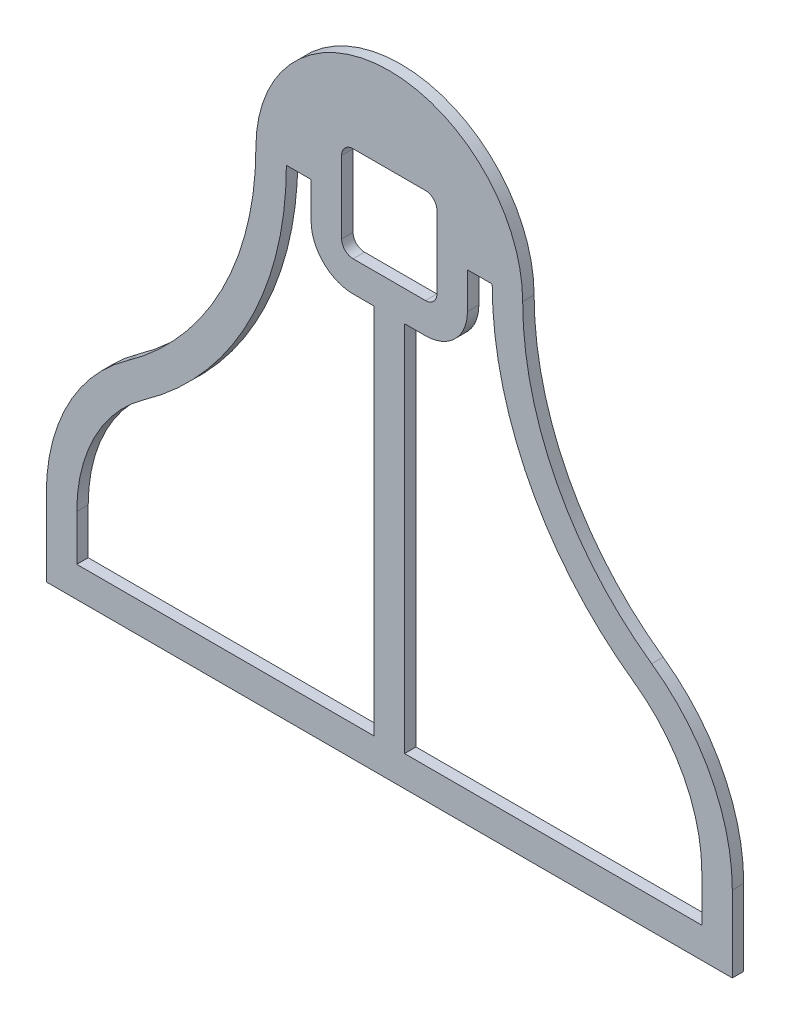
ISO-10303-21;
HEADER;
FILE_DESCRIPTION(('STEP AP214'),'2;1');
FILE_NAME('part.step','',(''),(''),'','','');
FILE_SCHEMA(('AUTOMOTIVE_DESIGN { 1 0 10303 214 1 1 1 1 }'));
ENDSEC;
DATA;
#1=APPLICATION_CONTEXT('core data for automotive mechanical design processes');
#2=APPLICATION_PROTOCOL_DEFINITION('international standard','automotive_design',2000,#1);
#3=PRODUCT_CONTEXT('',#1,'mechanical');
#4=PRODUCT('Part','Part','',(#3));
#5=PRODUCT_RELATED_PRODUCT_CATEGORY('part','',(#4));
#6=PRODUCT_DEFINITION_FORMATION('','',#4);
#7=PRODUCT_DEFINITION_CONTEXT('part definition',#1,'design');
#8=PRODUCT_DEFINITION('design','',#6,#7);
#9=PRODUCT_DEFINITION_SHAPE('','',#8);
#10=(LENGTH_UNIT() NAMED_UNIT(*) SI_UNIT(.MILLI.,.METRE.));
#11=(NAMED_UNIT(*) PLANE_ANGLE_UNIT() SI_UNIT($,.RADIAN.));
#12=(NAMED_UNIT(*) SI_UNIT($,.STERADIAN.) SOLID_ANGLE_UNIT());
#13=UNCERTAINTY_MEASURE_WITH_UNIT(LENGTH_MEASURE(1.E-05),#10,'distance_accuracy_value','');
#14=(GEOMETRIC_REPRESENTATION_CONTEXT(3) GLOBAL_UNCERTAINTY_ASSIGNED_CONTEXT((#13)) GLOBAL_UNIT_ASSIGNED_CONTEXT((#10,
#11,#12)) REPRESENTATION_CONTEXT('',''));
#15=CARTESIAN_POINT('',(0.,0.,0.));
#16=DIRECTION('',(0.,0.,1.));
#17=DIRECTION('',(1.,0.,0.));
#18=AXIS2_PLACEMENT_3D('',#15,#16,#17);
#19=CARTESIAN_POINT('',(8.,146.816197092024,0.));
#20=DIRECTION('',(0.,-1.,0.));
#21=DIRECTION('',(0.,0.,-1.));
#22=AXIS2_PLACEMENT_3D('',#19,#20,#21);
#23=PLANE('',#22);
#24=DIRECTION('',(1.,0.,0.));
#25=VECTOR('',#24,1.);
#26=CARTESIAN_POINT('',(8.,146.816197092024,0.));
#27=LINE('',#26,#25);
#28=CARTESIAN_POINT('',(94.,146.816197092024,0.));
#29=VERTEX_POINT('',#28);
#30=CARTESIAN_POINT('',(172.,146.816197092024,0.));
#31=VERTEX_POINT('',#30);
#32=EDGE_CURVE('E50',#29,#31,#27,.T.);
#33=ORIENTED_EDGE('',*,*,#32,.F.);
#34=DIRECTION('',(0.,0.,1.));
#35=VECTOR('',#34,1.);
#36=CARTESIAN_POINT('',(94.,146.816197092024,0.));
#37=LINE('',#36,#35);
#38=CARTESIAN_POINT('',(94.,146.816197092024,3.));
#39=VERTEX_POINT('',#38);
#40=EDGE_CURVE('E292',#29,#39,#37,.T.);
#41=ORIENTED_EDGE('',*,*,#40,.T.);
#42=DIRECTION('',(1.,0.,0.));
#43=VECTOR('',#42,1.);
#44=CARTESIAN_POINT('',(50.,146.816197092024,3.));
#45=LINE('',#44,#43);
#46=CARTESIAN_POINT('',(172.,146.816197092024,3.));
#47=VERTEX_POINT('',#46);
#48=EDGE_CURVE('E533',#39,#47,#45,.T.);
#49=ORIENTED_EDGE('',*,*,#48,.T.);
#50=DIRECTION('',(0.,0.,1.));
#51=VECTOR('',#50,1.);
#52=CARTESIAN_POINT('',(172.,146.816197092024,0.));
#53=LINE('',#52,#51);
#54=EDGE_CURVE('E344',#31,#47,#53,.T.);
#55=ORIENTED_EDGE('',*,*,#54,.F.);
#56=EDGE_LOOP('',(#33,#41,#49,#55));
#57=FACE_BOUND('',#56,.T.);
#58=ADVANCED_FACE('F33',(#57),#23,.F.);
#59=CARTESIAN_POINT('',(80.5,244.5,0.));
#60=DIRECTION('',(0.,1.,0.));
#61=DIRECTION('',(0.,0.,1.));
#62=AXIS2_PLACEMENT_3D('',#59,#60,#61);
#63=PLANE('',#62);
#64=DIRECTION('',(1.,0.,0.));
#65=VECTOR('',#64,1.);
#66=CARTESIAN_POINT('',(80.5,244.5,3.));
#67=LINE('',#66,#65);
#68=CARTESIAN_POINT('',(99.5,244.5,3.));
#69=VERTEX_POINT('',#68);
#70=CARTESIAN_POINT('',(94.,244.5,3.));
#71=VERTEX_POINT('',#70);
#72=EDGE_CURVE('E270',#69,#71,#67,.F.);
#73=ORIENTED_EDGE('',*,*,#72,.T.);
#74=DIRECTION('',(0.,0.,1.));
#75=VECTOR('',#74,1.);
#76=CARTESIAN_POINT('',(94.,244.5,0.));
#77=LINE('',#76,#75);
#78=CARTESIAN_POINT('',(94.,244.5,0.));
#79=VERTEX_POINT('',#78);
#80=EDGE_CURVE('E279',#79,#71,#77,.T.);
#81=ORIENTED_EDGE('',*,*,#80,.F.);
#82=DIRECTION('',(-1.,0.,0.));
#83=VECTOR('',#82,1.);
#84=CARTESIAN_POINT('',(80.5,244.5,0.));
#85=LINE('',#84,#83);
#86=CARTESIAN_POINT('',(99.5,244.5,0.));
#87=VERTEX_POINT('',#86);
#88=EDGE_CURVE('E306',#87,#79,#85,.T.);
#89=ORIENTED_EDGE('',*,*,#88,.F.);
#90=DIRECTION('',(0.,0.,1.));
#91=VECTOR('',#90,1.);
#92=CARTESIAN_POINT('',(99.5,244.5,0.));
#93=LINE('',#92,#91);
#94=EDGE_CURVE('E363',#87,#69,#93,.T.);
#95=ORIENTED_EDGE('',*,*,#94,.T.);
#96=EDGE_LOOP('',(#73,#81,#89,#95));
#97=FACE_BOUND('',#96,.T.);
#98=ADVANCED_FACE('F588',(#97),#63,.F.);
#99=CARTESIAN_POINT('',(180.,0.,15.));
#100=DIRECTION('',(-1.,0.,0.));
#101=DIRECTION('',(0.,0.,1.));
#102=AXIS2_PLACEMENT_3D('',#99,#100,#101);
#103=PLANE('',#102);
#104=DIRECTION('',(0.,1.,0.));
#105=VECTOR('',#104,1.);
#106=CARTESIAN_POINT('',(180.,138.816197092024,3.));
#107=LINE('',#106,#105);
#108=CARTESIAN_POINT('',(180.,138.816197092024,3.));
#109=VERTEX_POINT('',#108);
#110=CARTESIAN_POINT('',(180.,158.816197092024,3.));
#111=VERTEX_POINT('',#110);
#112=EDGE_CURVE('E415',#109,#111,#107,.T.);
#113=ORIENTED_EDGE('',*,*,#112,.F.);
#114=DIRECTION('',(0.,0.,1.));
#115=VECTOR('',#114,1.);
#116=CARTESIAN_POINT('',(180.,138.816197092024,0.));
#117=LINE('',#116,#115);
#118=CARTESIAN_POINT('',(180.,138.816197092024,0.));
#119=VERTEX_POINT('',#118);
#120=EDGE_CURVE('E428',#119,#109,#117,.T.);
#121=ORIENTED_EDGE('',*,*,#120,.F.);
#122=DIRECTION('',(0.,1.,0.));
#123=VECTOR('',#122,1.);
#124=CARTESIAN_POINT('',(180.,0.,0.));
#125=LINE('',#124,#123);
#126=CARTESIAN_POINT('',(180.,158.816197092024,0.));
#127=VERTEX_POINT('',#126);
#128=EDGE_CURVE('E454',#119,#127,#125,.T.);
#129=ORIENTED_EDGE('',*,*,#128,.T.);
#130=DIRECTION('',(0.,0.,-1.));
#131=VECTOR('',#130,1.);
#132=CARTESIAN_POINT('',(180.,158.816197092024,15.));
#133=LINE('',#132,#131);
#134=EDGE_CURVE('E471',#127,#111,#133,.F.);
#135=ORIENTED_EDGE('',*,*,#134,.T.);
#136=EDGE_LOOP('',(#113,#121,#129,#135));
#137=FACE_BOUND('',#136,.T.);
#138=ADVANCED_FACE('F593',(#137),#103,.F.);
#139=CARTESIAN_POINT('',(0.,0.,15.));
#140=DIRECTION('',(1.,0.,0.));
#141=DIRECTION('',(0.,0.,-1.));
#142=AXIS2_PLACEMENT_3D('',#139,#140,#141);
#143=PLANE('',#142);
#144=DIRECTION('',(0.,-1.,0.));
#145=VECTOR('',#144,1.);
#146=CARTESIAN_POINT('',(0.,158.816197092024,3.));
#147=LINE('',#146,#145);
#148=CARTESIAN_POINT('',(0.,158.816197092024,3.));
#149=VERTEX_POINT('',#148);
#150=CARTESIAN_POINT('',(0.,138.816197092024,3.));
#151=VERTEX_POINT('',#150);
#152=EDGE_CURVE('E411',#149,#151,#147,.T.);
#153=ORIENTED_EDGE('',*,*,#152,.F.);
#154=DIRECTION('',(0.,0.,-1.));
#155=VECTOR('',#154,1.);
#156=CARTESIAN_POINT('',(0.,158.816197092024,15.));
#157=LINE('',#156,#155);
#158=CARTESIAN_POINT('',(0.,158.816197092024,0.));
#159=VERTEX_POINT('',#158);
#160=EDGE_CURVE('E456',#149,#159,#157,.T.);
#161=ORIENTED_EDGE('',*,*,#160,.T.);
#162=DIRECTION('',(0.,-1.,0.));
#163=VECTOR('',#162,1.);
#164=CARTESIAN_POINT('',(0.,0.,0.));
#165=LINE('',#164,#163);
#166=CARTESIAN_POINT('',(0.,138.816197092024,0.));
#167=VERTEX_POINT('',#166);
#168=EDGE_CURVE('E444',#159,#167,#165,.T.);
#169=ORIENTED_EDGE('',*,*,#168,.T.);
#170=DIRECTION('',(0.,0.,1.));
#171=VECTOR('',#170,1.);
#172=CARTESIAN_POINT('',(0.,138.816197092024,0.));
#173=LINE('',#172,#171);
#174=EDGE_CURVE('E429',#167,#151,#173,.T.);
#175=ORIENTED_EDGE('',*,*,#174,.T.);
#176=EDGE_LOOP('',(#153,#161,#169,#175));
#177=FACE_BOUND('',#176,.T.);
#178=ADVANCED_FACE('F847',(#177),#143,.F.);
#179=CARTESIAN_POINT('',(90.,265.,15.));
#180=DIRECTION('',(0.,0.,-1.));
#181=DIRECTION('',(-1.,0.,0.));
#182=AXIS2_PLACEMENT_3D('',#179,#180,#181);
#183=CYLINDRICAL_SURFACE('',#182,35.);
#184=CARTESIAN_POINT('',(90.,265.,3.));
#185=DIRECTION('',(0.,0.,1.));
#186=DIRECTION('',(1.,0.,0.));
#187=AXIS2_PLACEMENT_3D('',#184,#185,#186);
#188=CIRCLE('',#187,35.);
#189=CARTESIAN_POINT('',(125.,265.,3.));
#190=VERTEX_POINT('',#189);
#191=CARTESIAN_POINT('',(55.,265.,3.));
#192=VERTEX_POINT('',#191);
#193=EDGE_CURVE('E421',#190,#192,#188,.T.);
#194=ORIENTED_EDGE('',*,*,#193,.F.);
#195=DIRECTION('',(0.,0.,-1.));
#196=VECTOR('',#195,1.);
#197=CARTESIAN_POINT('',(125.,265.,15.));
#198=LINE('',#197,#196);
#199=CARTESIAN_POINT('',(125.,265.,0.));
#200=VERTEX_POINT('',#199);
#201=EDGE_CURVE('E432',#190,#200,#198,.T.);
#202=ORIENTED_EDGE('',*,*,#201,.T.);
#203=CARTESIAN_POINT('',(90.,265.,0.));
#204=DIRECTION('',(0.,0.,-1.));
#205=DIRECTION('',(-1.,0.,0.));
#206=AXIS2_PLACEMENT_3D('',#203,#204,#205);
#207=CIRCLE('',#206,35.);
#208=CARTESIAN_POINT('',(55.,265.,0.));
#209=VERTEX_POINT('',#208);
#210=EDGE_CURVE('E437',#200,#209,#207,.F.);
#211=ORIENTED_EDGE('',*,*,#210,.T.);
#212=DIRECTION('',(0.,0.,-1.));
#213=VECTOR('',#212,1.);
#214=CARTESIAN_POINT('',(55.,265.,15.));
#215=LINE('',#214,#213);
#216=EDGE_CURVE('E435',#192,#209,#215,.T.);
#217=ORIENTED_EDGE('',*,*,#216,.F.);
#218=EDGE_LOOP('',(#194,#202,#211,#217));
#219=FACE_BOUND('',#218,.T.);
#220=ADVANCED_FACE('F837',(#219),#183,.T.);
#221=CARTESIAN_POINT('',(-25.,265.,15.));
#222=DIRECTION('',(0.,0.,-1.));
#223=DIRECTION('',(-1.,0.,0.));
#224=AXIS2_PLACEMENT_3D('',#221,#222,#223);
#225=CYLINDRICAL_SURFACE('',#224,80.);
#226=CARTESIAN_POINT('',(-25.,265.,3.));
#227=DIRECTION('',(0.,0.,-1.));
#228=DIRECTION('',(1.,0.,0.));
#229=AXIS2_PLACEMENT_3D('',#226,#227,#228);
#230=CIRCLE('',#229,80.);
#231=CARTESIAN_POINT('',(21.1538461538462,199.656121287399,3.));
#232=VERTEX_POINT('',#231);
#233=EDGE_CURVE('E423',#192,#232,#230,.T.);
#234=ORIENTED_EDGE('',*,*,#233,.F.);
#235=ORIENTED_EDGE('',*,*,#216,.T.);
#236=CARTESIAN_POINT('',(-25.,265.,0.));
#237=DIRECTION('',(0.,0.,-1.));
#238=DIRECTION('',(-1.,0.,0.));
#239=AXIS2_PLACEMENT_3D('',#236,#237,#238);
#240=CIRCLE('',#239,80.);
#241=CARTESIAN_POINT('',(21.1538461538461,199.656121287399,0.));
#242=VERTEX_POINT('',#241);
#243=EDGE_CURVE('E441',#209,#242,#240,.T.);
#244=ORIENTED_EDGE('',*,*,#243,.T.);
#245=DIRECTION('',(0.,0.,-1.));
#246=VECTOR('',#245,1.);
#247=CARTESIAN_POINT('',(21.1538461538461,199.656121287399,15.));
#248=LINE('',#247,#246);
#249=EDGE_CURVE('E466',#242,#232,#248,.F.);
#250=ORIENTED_EDGE('',*,*,#249,.T.);
#251=EDGE_LOOP('',(#234,#235,#244,#250));
#252=FACE_BOUND('',#251,.T.);
#253=ADVANCED_FACE('F827',(#252),#225,.F.);
#254=CARTESIAN_POINT('',(205.,265.,15.));
#255=DIRECTION('',(0.,0.,-1.));
#256=DIRECTION('',(-1.,0.,0.));
#257=AXIS2_PLACEMENT_3D('',#254,#255,#256);
#258=CYLINDRICAL_SURFACE('',#257,80.);
#259=CARTESIAN_POINT('',(205.,265.,3.));
#260=DIRECTION('',(0.,0.,-1.));
#261=DIRECTION('',(1.,0.,0.));
#262=AXIS2_PLACEMENT_3D('',#259,#260,#261);
#263=CIRCLE('',#262,80.);
#264=CARTESIAN_POINT('',(158.846153846154,199.656121287399,3.));
#265=VERTEX_POINT('',#264);
#266=EDGE_CURVE('E419',#265,#190,#263,.T.);
#267=ORIENTED_EDGE('',*,*,#266,.F.);
#268=DIRECTION('',(0.,0.,-1.));
#269=VECTOR('',#268,1.);
#270=CARTESIAN_POINT('',(158.846153846154,199.656121287399,15.));
#271=LINE('',#270,#269);
#272=CARTESIAN_POINT('',(158.846153846154,199.656121287399,0.));
#273=VERTEX_POINT('',#272);
#274=EDGE_CURVE('E469',#265,#273,#271,.T.);
#275=ORIENTED_EDGE('',*,*,#274,.T.);
#276=CARTESIAN_POINT('',(205.,265.,0.));
#277=DIRECTION('',(0.,0.,-1.));
#278=DIRECTION('',(-1.,0.,0.));
#279=AXIS2_PLACEMENT_3D('',#276,#277,#278);
#280=CIRCLE('',#279,80.);
#281=EDGE_CURVE('E459',#273,#200,#280,.T.);
#282=ORIENTED_EDGE('',*,*,#281,.T.);
#283=ORIENTED_EDGE('',*,*,#201,.F.);
#284=EDGE_LOOP('',(#267,#275,#282,#283));
#285=FACE_BOUND('',#284,.T.);
#286=ADVANCED_FACE('F817',(#285),#258,.F.);
#287=CARTESIAN_POINT('',(50.,158.816197092024,15.));
#288=DIRECTION('',(0.,0.,-1.));
#289=DIRECTION('',(-1.,0.,0.));
#290=AXIS2_PLACEMENT_3D('',#287,#288,#289);
#291=CYLINDRICAL_SURFACE('',#290,50.);
#292=ORIENTED_EDGE('',*,*,#160,.F.);
#293=CARTESIAN_POINT('',(50.,158.816197092024,3.));
#294=DIRECTION('',(0.,0.,1.));
#295=DIRECTION('',(1.,0.,0.));
#296=AXIS2_PLACEMENT_3D('',#293,#294,#295);
#297=CIRCLE('',#296,50.);
#298=EDGE_CURVE('E409',#232,#149,#297,.T.);
#299=ORIENTED_EDGE('',*,*,#298,.F.);
#300=ORIENTED_EDGE('',*,*,#249,.F.);
#301=CARTESIAN_POINT('',(50.,158.816197092024,0.));
#302=DIRECTION('',(0.,0.,-1.));
#303=DIRECTION('',(-1.,0.,0.));
#304=AXIS2_PLACEMENT_3D('',#301,#302,#303);
#305=CIRCLE('',#304,50.);
#306=EDGE_CURVE('E464',#159,#242,#305,.T.);
#307=ORIENTED_EDGE('',*,*,#306,.F.);
#308=EDGE_LOOP('',(#292,#299,#300,#307));
#309=FACE_BOUND('',#308,.T.);
#310=ADVANCED_FACE('F807',(#309),#291,.T.);
#311=CARTESIAN_POINT('',(130.,158.816197092024,15.));
#312=DIRECTION('',(0.,0.,-1.));
#313=DIRECTION('',(-1.,0.,0.));
#314=AXIS2_PLACEMENT_3D('',#311,#312,#313);
#315=CYLINDRICAL_SURFACE('',#314,50.);
#316=ORIENTED_EDGE('',*,*,#274,.F.);
#317=CARTESIAN_POINT('',(130.,158.816197092024,3.));
#318=DIRECTION('',(0.,0.,1.));
#319=DIRECTION('',(1.,0.,0.));
#320=AXIS2_PLACEMENT_3D('',#317,#318,#319);
#321=CIRCLE('',#320,50.);
#322=EDGE_CURVE('E417',#111,#265,#321,.T.);
#323=ORIENTED_EDGE('',*,*,#322,.F.);
#324=ORIENTED_EDGE('',*,*,#134,.F.);
#325=CARTESIAN_POINT('',(130.,158.816197092024,0.));
#326=DIRECTION('',(0.,0.,-1.));
#327=DIRECTION('',(-1.,0.,0.));
#328=AXIS2_PLACEMENT_3D('',#325,#326,#327);
#329=CIRCLE('',#328,50.);
#330=EDGE_CURVE('E458',#273,#127,#329,.T.);
#331=ORIENTED_EDGE('',*,*,#330,.F.);
#332=EDGE_LOOP('',(#316,#323,#324,#331));
#333=FACE_BOUND('',#332,.T.);
#334=ADVANCED_FACE('F797',(#333),#315,.T.);
#335=CARTESIAN_POINT('',(77.5,277.5,15.));
#336=DIRECTION('',(-1.,0.,0.));
#337=DIRECTION('',(0.,0.,1.));
#338=AXIS2_PLACEMENT_3D('',#335,#336,#337);
#339=PLANE('',#338);
#340=DIRECTION('',(0.,-1.,0.));
#341=VECTOR('',#340,1.);
#342=CARTESIAN_POINT('',(77.5,255.5,3.));
#343=LINE('',#342,#341);
#344=CARTESIAN_POINT('',(77.5,274.5,3.));
#345=VERTEX_POINT('',#344);
#346=CARTESIAN_POINT('',(77.5,255.5,3.));
#347=VERTEX_POINT('',#346);
#348=EDGE_CURVE('E400',#345,#347,#343,.T.);
#349=ORIENTED_EDGE('',*,*,#348,.T.);
#350=DIRECTION('',(0.,0.,-1.));
#351=VECTOR('',#350,1.);
#352=CARTESIAN_POINT('',(77.5,255.5,0.));
#353=LINE('',#352,#351);
#354=CARTESIAN_POINT('',(77.5,255.5,0.));
#355=VERTEX_POINT('',#354);
#356=EDGE_CURVE('E491',#347,#355,#353,.T.);
#357=ORIENTED_EDGE('',*,*,#356,.T.);
#358=DIRECTION('',(0.,1.,0.));
#359=VECTOR('',#358,1.);
#360=CARTESIAN_POINT('',(77.5,0.,0.));
#361=LINE('',#360,#359);
#362=CARTESIAN_POINT('',(77.5,274.5,0.));
#363=VERTEX_POINT('',#362);
#364=EDGE_CURVE('E483',#355,#363,#361,.T.);
#365=ORIENTED_EDGE('',*,*,#364,.T.);
#366=DIRECTION('',(0.,0.,-1.));
#367=VECTOR('',#366,1.);
#368=CARTESIAN_POINT('',(77.5,274.5,15.));
#369=LINE('',#368,#367);
#370=EDGE_CURVE('E493',#363,#345,#369,.F.);
#371=ORIENTED_EDGE('',*,*,#370,.T.);
#372=EDGE_LOOP('',(#349,#357,#365,#371));
#373=FACE_BOUND('',#372,.T.);
#374=ADVANCED_FACE('F787',(#373),#339,.F.);
#375=CARTESIAN_POINT('',(102.5,252.5,15.));
#376=DIRECTION('',(0.,-1.,0.));
#377=DIRECTION('',(0.,0.,-1.));
#378=AXIS2_PLACEMENT_3D('',#375,#376,#377);
#379=PLANE('',#378);
#380=DIRECTION('',(1.,0.,0.));
#381=VECTOR('',#380,1.);
#382=CARTESIAN_POINT('',(99.5,252.5,3.));
#383=LINE('',#382,#381);
#384=CARTESIAN_POINT('',(80.5,252.5,3.));
#385=VERTEX_POINT('',#384);
#386=CARTESIAN_POINT('',(99.5,252.5,3.));
#387=VERTEX_POINT('',#386);
#388=EDGE_CURVE('E406',#385,#387,#383,.T.);
#389=ORIENTED_EDGE('',*,*,#388,.T.);
#390=DIRECTION('',(0.,0.,-1.));
#391=VECTOR('',#390,1.);
#392=CARTESIAN_POINT('',(99.5,252.5,0.));
#393=LINE('',#392,#391);
#394=CARTESIAN_POINT('',(99.5,252.5,0.));
#395=VERTEX_POINT('',#394);
#396=EDGE_CURVE('E501',#387,#395,#393,.T.);
#397=ORIENTED_EDGE('',*,*,#396,.T.);
#398=DIRECTION('',(-1.,0.,0.));
#399=VECTOR('',#398,1.);
#400=CARTESIAN_POINT('',(0.,252.5,0.));
#401=LINE('',#400,#399);
#402=CARTESIAN_POINT('',(80.5,252.5,0.));
#403=VERTEX_POINT('',#402);
#404=EDGE_CURVE('E480',#395,#403,#401,.T.);
#405=ORIENTED_EDGE('',*,*,#404,.T.);
#406=DIRECTION('',(0.,0.,-1.));
#407=VECTOR('',#406,1.);
#408=CARTESIAN_POINT('',(80.5,252.5,15.));
#409=LINE('',#408,#407);
#410=EDGE_CURVE('E503',#403,#385,#409,.F.);
#411=ORIENTED_EDGE('',*,*,#410,.T.);
#412=EDGE_LOOP('',(#389,#397,#405,#411));
#413=FACE_BOUND('',#412,.T.);
#414=ADVANCED_FACE('F777',(#413),#379,.F.);
#415=CARTESIAN_POINT('',(102.5,277.5,15.));
#416=DIRECTION('',(1.,0.,0.));
#417=DIRECTION('',(0.,0.,-1.));
#418=AXIS2_PLACEMENT_3D('',#415,#416,#417);
#419=PLANE('',#418);
#420=DIRECTION('',(0.,1.,0.));
#421=VECTOR('',#420,1.);
#422=CARTESIAN_POINT('',(102.5,274.5,3.));
#423=LINE('',#422,#421);
#424=CARTESIAN_POINT('',(102.5,255.5,3.));
#425=VERTEX_POINT('',#424);
#426=CARTESIAN_POINT('',(102.5,274.5,3.));
#427=VERTEX_POINT('',#426);
#428=EDGE_CURVE('E388',#425,#427,#423,.T.);
#429=ORIENTED_EDGE('',*,*,#428,.T.);
#430=DIRECTION('',(0.,0.,-1.));
#431=VECTOR('',#430,1.);
#432=CARTESIAN_POINT('',(102.5,274.5,0.));
#433=LINE('',#432,#431);
#434=CARTESIAN_POINT('',(102.5,274.5,0.));
#435=VERTEX_POINT('',#434);
#436=EDGE_CURVE('E499',#427,#435,#433,.T.);
#437=ORIENTED_EDGE('',*,*,#436,.T.);
#438=DIRECTION('',(0.,-1.,0.));
#439=VECTOR('',#438,1.);
#440=CARTESIAN_POINT('',(102.5,0.,0.));
#441=LINE('',#440,#439);
#442=CARTESIAN_POINT('',(102.5,255.5,0.));
#443=VERTEX_POINT('',#442);
#444=EDGE_CURVE('E477',#435,#443,#441,.T.);
#445=ORIENTED_EDGE('',*,*,#444,.T.);
#446=DIRECTION('',(0.,0.,-1.));
#447=VECTOR('',#446,1.);
#448=CARTESIAN_POINT('',(102.5,255.5,15.));
#449=LINE('',#448,#447);
#450=EDGE_CURVE('E496',#443,#425,#449,.F.);
#451=ORIENTED_EDGE('',*,*,#450,.T.);
#452=EDGE_LOOP('',(#429,#437,#445,#451));
#453=FACE_BOUND('',#452,.T.);
#454=ADVANCED_FACE('F767',(#453),#419,.F.);
#455=CARTESIAN_POINT('',(102.5,277.5,15.));
#456=DIRECTION('',(0.,1.,0.));
#457=DIRECTION('',(0.,0.,1.));
#458=AXIS2_PLACEMENT_3D('',#455,#456,#457);
#459=PLANE('',#458);
#460=DIRECTION('',(-1.,0.,0.));
#461=VECTOR('',#460,1.);
#462=CARTESIAN_POINT('',(80.5,277.5,3.));
#463=LINE('',#462,#461);
#464=CARTESIAN_POINT('',(99.5,277.5,3.));
#465=VERTEX_POINT('',#464);
#466=CARTESIAN_POINT('',(80.5,277.5,3.));
#467=VERTEX_POINT('',#466);
#468=EDGE_CURVE('E394',#465,#467,#463,.T.);
#469=ORIENTED_EDGE('',*,*,#468,.T.);
#470=DIRECTION('',(0.,0.,-1.));
#471=VECTOR('',#470,1.);
#472=CARTESIAN_POINT('',(80.5,277.5,0.));
#473=LINE('',#472,#471);
#474=CARTESIAN_POINT('',(80.5,277.5,0.));
#475=VERTEX_POINT('',#474);
#476=EDGE_CURVE('E489',#467,#475,#473,.T.);
#477=ORIENTED_EDGE('',*,*,#476,.T.);
#478=DIRECTION('',(1.,0.,0.));
#479=VECTOR('',#478,1.);
#480=CARTESIAN_POINT('',(0.,277.5,0.));
#481=LINE('',#480,#479);
#482=CARTESIAN_POINT('',(99.5,277.5,0.));
#483=VERTEX_POINT('',#482);
#484=EDGE_CURVE('E474',#475,#483,#481,.T.);
#485=ORIENTED_EDGE('',*,*,#484,.T.);
#486=DIRECTION('',(0.,0.,-1.));
#487=VECTOR('',#486,1.);
#488=CARTESIAN_POINT('',(99.5,277.5,15.));
#489=LINE('',#488,#487);
#490=EDGE_CURVE('E486',#483,#465,#489,.F.);
#491=ORIENTED_EDGE('',*,*,#490,.T.);
#492=EDGE_LOOP('',(#469,#477,#485,#491));
#493=FACE_BOUND('',#492,.T.);
#494=ADVANCED_FACE('F757',(#493),#459,.F.);
#495=CARTESIAN_POINT('',(80.5,274.5,15.));
#496=DIRECTION('',(0.,0.,1.));
#497=DIRECTION('',(1.,0.,0.));
#498=AXIS2_PLACEMENT_3D('',#495,#496,#497);
#499=CYLINDRICAL_SURFACE('',#498,3.);
#500=CARTESIAN_POINT('',(80.5,274.5,3.));
#501=DIRECTION('',(0.,0.,1.));
#502=DIRECTION('',(1.,0.,0.));
#503=AXIS2_PLACEMENT_3D('',#500,#501,#502);
#504=CIRCLE('',#503,3.);
#505=EDGE_CURVE('E397',#467,#345,#504,.T.);
#506=ORIENTED_EDGE('',*,*,#505,.T.);
#507=ORIENTED_EDGE('',*,*,#370,.F.);
#508=CARTESIAN_POINT('',(80.5,274.5,0.));
#509=DIRECTION('',(0.,0.,-1.));
#510=DIRECTION('',(-1.,0.,0.));
#511=AXIS2_PLACEMENT_3D('',#508,#509,#510);
#512=CIRCLE('',#511,3.);
#513=EDGE_CURVE('E506',#475,#363,#512,.F.);
#514=ORIENTED_EDGE('',*,*,#513,.F.);
#515=ORIENTED_EDGE('',*,*,#476,.F.);
#516=EDGE_LOOP('',(#506,#507,#514,#515));
#517=FACE_BOUND('',#516,.T.);
#518=ADVANCED_FACE('F747',(#517),#499,.F.);
#519=CARTESIAN_POINT('',(99.5,274.5,15.));
#520=DIRECTION('',(0.,0.,1.));
#521=DIRECTION('',(1.,0.,0.));
#522=AXIS2_PLACEMENT_3D('',#519,#520,#521);
#523=CYLINDRICAL_SURFACE('',#522,3.);
#524=CARTESIAN_POINT('',(99.5,274.5,3.));
#525=DIRECTION('',(0.,0.,1.));
#526=DIRECTION('',(1.,0.,0.));
#527=AXIS2_PLACEMENT_3D('',#524,#525,#526);
#528=CIRCLE('',#527,3.);
#529=EDGE_CURVE('E391',#427,#465,#528,.T.);
#530=ORIENTED_EDGE('',*,*,#529,.T.);
#531=ORIENTED_EDGE('',*,*,#490,.F.);
#532=CARTESIAN_POINT('',(99.5,274.5,0.));
#533=DIRECTION('',(0.,0.,-1.));
#534=DIRECTION('',(-1.,0.,0.));
#535=AXIS2_PLACEMENT_3D('',#532,#533,#534);
#536=CIRCLE('',#535,3.);
#537=EDGE_CURVE('E508',#435,#483,#536,.F.);
#538=ORIENTED_EDGE('',*,*,#537,.F.);
#539=ORIENTED_EDGE('',*,*,#436,.F.);
#540=EDGE_LOOP('',(#530,#531,#538,#539));
#541=FACE_BOUND('',#540,.T.);
#542=ADVANCED_FACE('F738',(#541),#523,.F.);
#543=CARTESIAN_POINT('',(80.5,255.5,15.));
#544=DIRECTION('',(0.,0.,1.));
#545=DIRECTION('',(1.,0.,0.));
#546=AXIS2_PLACEMENT_3D('',#543,#544,#545);
#547=CYLINDRICAL_SURFACE('',#546,3.);
#548=CARTESIAN_POINT('',(80.5,255.5,3.));
#549=DIRECTION('',(0.,0.,1.));
#550=DIRECTION('',(1.,0.,0.));
#551=AXIS2_PLACEMENT_3D('',#548,#549,#550);
#552=CIRCLE('',#551,3.);
#553=EDGE_CURVE('E403',#347,#385,#552,.T.);
#554=ORIENTED_EDGE('',*,*,#553,.T.);
#555=ORIENTED_EDGE('',*,*,#410,.F.);
#556=CARTESIAN_POINT('',(80.5,255.5,0.));
#557=DIRECTION('',(0.,0.,-1.));
#558=DIRECTION('',(-1.,0.,0.));
#559=AXIS2_PLACEMENT_3D('',#556,#557,#558);
#560=CIRCLE('',#559,3.);
#561=EDGE_CURVE('E510',#355,#403,#560,.F.);
#562=ORIENTED_EDGE('',*,*,#561,.F.);
#563=ORIENTED_EDGE('',*,*,#356,.F.);
#564=EDGE_LOOP('',(#554,#555,#562,#563));
#565=FACE_BOUND('',#564,.T.);
#566=ADVANCED_FACE('F729',(#565),#547,.F.);
#567=CARTESIAN_POINT('',(99.5,255.5,15.));
#568=DIRECTION('',(0.,0.,1.));
#569=DIRECTION('',(1.,0.,0.));
#570=AXIS2_PLACEMENT_3D('',#567,#568,#569);
#571=CYLINDRICAL_SURFACE('',#570,3.);
#572=CARTESIAN_POINT('',(99.5,255.5,3.));
#573=DIRECTION('',(0.,0.,1.));
#574=DIRECTION('',(1.,0.,0.));
#575=AXIS2_PLACEMENT_3D('',#572,#573,#574);
#576=CIRCLE('',#575,3.);
#577=EDGE_CURVE('E371',#387,#425,#576,.T.);
#578=ORIENTED_EDGE('',*,*,#577,.T.);
#579=ORIENTED_EDGE('',*,*,#450,.F.);
#580=CARTESIAN_POINT('',(99.5,255.5,0.));
#581=DIRECTION('',(0.,0.,-1.));
#582=DIRECTION('',(-1.,0.,0.));
#583=AXIS2_PLACEMENT_3D('',#580,#581,#582);
#584=CIRCLE('',#583,3.);
#585=EDGE_CURVE('E512',#395,#443,#584,.F.);
#586=ORIENTED_EDGE('',*,*,#585,.F.);
#587=ORIENTED_EDGE('',*,*,#396,.F.);
#588=EDGE_LOOP('',(#578,#579,#586,#587));
#589=FACE_BOUND('',#588,.T.);
#590=ADVANCED_FACE('F35',(#589),#571,.F.);
#591=CARTESIAN_POINT('',(0.,138.816197092024,0.));
#592=DIRECTION('',(0.,1.,0.));
#593=DIRECTION('',(0.,0.,1.));
#594=AXIS2_PLACEMENT_3D('',#591,#592,#593);
#595=PLANE('',#594);
#596=DIRECTION('',(1.,0.,0.));
#597=VECTOR('',#596,1.);
#598=CARTESIAN_POINT('',(0.,138.816197092024,3.));
#599=LINE('',#598,#597);
#600=EDGE_CURVE('E413',#151,#109,#599,.T.);
#601=ORIENTED_EDGE('',*,*,#600,.F.);
#602=ORIENTED_EDGE('',*,*,#174,.F.);
#603=DIRECTION('',(-1.,0.,0.));
#604=VECTOR('',#603,1.);
#605=CARTESIAN_POINT('',(0.,138.816197092024,0.));
#606=LINE('',#605,#604);
#607=EDGE_CURVE('E425',#119,#167,#606,.T.);
#608=ORIENTED_EDGE('',*,*,#607,.F.);
#609=ORIENTED_EDGE('',*,*,#120,.T.);
#610=EDGE_LOOP('',(#601,#602,#608,#609));
#611=FACE_BOUND('',#610,.T.);
#612=ADVANCED_FACE('F713',(#611),#595,.F.);
#613=CARTESIAN_POINT('',(0.,0.,0.));
#614=DIRECTION('',(0.,0.,-1.));
#615=DIRECTION('',(-1.,0.,0.));
#616=AXIS2_PLACEMENT_3D('',#613,#614,#615);
#617=PLANE('',#616);
#618=DIRECTION('',(0.,1.,0.));
#619=VECTOR('',#618,1.);
#620=CARTESIAN_POINT('',(94.,146.816197092024,0.));
#621=LINE('',#620,#619);
#622=EDGE_CURVE('E282',#29,#79,#621,.T.);
#623=ORIENTED_EDGE('',*,*,#622,.F.);
#624=ORIENTED_EDGE('',*,*,#32,.T.);
#625=DIRECTION('',(0.,1.,0.));
#626=VECTOR('',#625,1.);
#627=CARTESIAN_POINT('',(172.,146.816197092024,0.));
#628=LINE('',#627,#626);
#629=CARTESIAN_POINT('',(172.,158.816197092024,0.));
#630=VERTEX_POINT('',#629);
#631=EDGE_CURVE('E329',#31,#630,#628,.T.);
#632=ORIENTED_EDGE('',*,*,#631,.T.);
#633=CARTESIAN_POINT('',(130.,158.816197092024,0.));
#634=DIRECTION('',(0.,0.,1.));
#635=DIRECTION('',(1.,0.,0.));
#636=AXIS2_PLACEMENT_3D('',#633,#634,#635);
#637=CIRCLE('',#636,42.);
#638=CARTESIAN_POINT('',(154.230769230769,193.121733416139,0.));
#639=VERTEX_POINT('',#638);
#640=EDGE_CURVE('E332',#630,#639,#637,.T.);
#641=ORIENTED_EDGE('',*,*,#640,.T.);
#642=CARTESIAN_POINT('',(205.,265.,0.));
#643=DIRECTION('',(0.,0.,-1.));
#644=DIRECTION('',(1.,0.,0.));
#645=AXIS2_PLACEMENT_3D('',#642,#643,#644);
#646=CIRCLE('',#645,88.);
#647=CARTESIAN_POINT('',(117.,265.,0.));
#648=VERTEX_POINT('',#647);
#649=EDGE_CURVE('E335',#639,#648,#646,.T.);
#650=ORIENTED_EDGE('',*,*,#649,.T.);
#651=DIRECTION('',(-1.,0.,0.));
#652=VECTOR('',#651,1.);
#653=CARTESIAN_POINT('',(110.5,265.,0.));
#654=LINE('',#653,#652);
#655=CARTESIAN_POINT('',(110.5,265.,0.));
#656=VERTEX_POINT('',#655);
#657=EDGE_CURVE('E294',#648,#656,#654,.T.);
#658=ORIENTED_EDGE('',*,*,#657,.T.);
#659=DIRECTION('',(0.,-1.,0.));
#660=VECTOR('',#659,1.);
#661=CARTESIAN_POINT('',(110.5,255.5,0.));
#662=LINE('',#661,#660);
#663=CARTESIAN_POINT('',(110.5,255.5,0.));
#664=VERTEX_POINT('',#663);
#665=EDGE_CURVE('E300',#656,#664,#662,.T.);
#666=ORIENTED_EDGE('',*,*,#665,.T.);
#667=CARTESIAN_POINT('',(99.5,255.5,0.));
#668=DIRECTION('',(0.,0.,-1.));
#669=DIRECTION('',(1.,0.,0.));
#670=AXIS2_PLACEMENT_3D('',#667,#668,#669);
#671=CIRCLE('',#670,11.);
#672=EDGE_CURVE('E303',#664,#87,#671,.T.);
#673=ORIENTED_EDGE('',*,*,#672,.T.);
#674=ORIENTED_EDGE('',*,*,#88,.T.);
#675=EDGE_LOOP('',(#623,#624,#632,#641,#650,#658,#666,#673,#674));
#676=FACE_BOUND('',#675,.T.);
#677=CARTESIAN_POINT('',(8.,146.816197092024,0.));
#678=VERTEX_POINT('',#677);
#679=CARTESIAN_POINT('',(86.,146.816197092024,0.));
#680=VERTEX_POINT('',#679);
#681=EDGE_CURVE('E327',#678,#680,#27,.T.);
#682=ORIENTED_EDGE('',*,*,#681,.T.);
#683=DIRECTION('',(0.,-1.,0.));
#684=VECTOR('',#683,1.);
#685=CARTESIAN_POINT('',(86.,146.816197092024,0.));
#686=LINE('',#685,#684);
#687=CARTESIAN_POINT('',(86.,244.5,0.));
#688=VERTEX_POINT('',#687);
#689=EDGE_CURVE('E286',#688,#680,#686,.T.);
#690=ORIENTED_EDGE('',*,*,#689,.F.);
#691=CARTESIAN_POINT('',(80.5,244.5,0.));
#692=VERTEX_POINT('',#691);
#693=EDGE_CURVE('E275',#688,#692,#85,.T.);
#694=ORIENTED_EDGE('',*,*,#693,.T.);
#695=CARTESIAN_POINT('',(80.5,255.5,0.));
#696=DIRECTION('',(0.,0.,-1.));
#697=DIRECTION('',(1.,0.,0.));
#698=AXIS2_PLACEMENT_3D('',#695,#696,#697);
#699=CIRCLE('',#698,11.);
#700=CARTESIAN_POINT('',(69.5,255.5,0.));
#701=VERTEX_POINT('',#700);
#702=EDGE_CURVE('E309',#692,#701,#699,.T.);
#703=ORIENTED_EDGE('',*,*,#702,.T.);
#704=DIRECTION('',(0.,1.,0.));
#705=VECTOR('',#704,1.);
#706=CARTESIAN_POINT('',(69.5,255.5,0.));
#707=LINE('',#706,#705);
#708=CARTESIAN_POINT('',(69.5,265.,0.));
#709=VERTEX_POINT('',#708);
#710=EDGE_CURVE('E312',#701,#709,#707,.T.);
#711=ORIENTED_EDGE('',*,*,#710,.T.);
#712=DIRECTION('',(-1.,0.,0.));
#713=VECTOR('',#712,1.);
#714=CARTESIAN_POINT('',(69.5,265.,0.));
#715=LINE('',#714,#713);
#716=CARTESIAN_POINT('',(63.,265.,0.));
#717=VERTEX_POINT('',#716);
#718=EDGE_CURVE('E315',#709,#717,#715,.T.);
#719=ORIENTED_EDGE('',*,*,#718,.T.);
#720=CARTESIAN_POINT('',(-25.,265.,0.));
#721=DIRECTION('',(0.,0.,-1.));
#722=DIRECTION('',(1.,0.,0.));
#723=AXIS2_PLACEMENT_3D('',#720,#721,#722);
#724=CIRCLE('',#723,88.);
#725=CARTESIAN_POINT('',(25.7692307692308,193.121733416139,0.));
#726=VERTEX_POINT('',#725);
#727=EDGE_CURVE('E318',#717,#726,#724,.T.);
#728=ORIENTED_EDGE('',*,*,#727,.T.);
#729=CARTESIAN_POINT('',(50.,158.816197092024,0.));
#730=DIRECTION('',(0.,0.,1.));
#731=DIRECTION('',(1.,0.,0.));
#732=AXIS2_PLACEMENT_3D('',#729,#730,#731);
#733=CIRCLE('',#732,42.);
#734=CARTESIAN_POINT('',(7.99999999999998,158.816197092024,0.));
#735=VERTEX_POINT('',#734);
#736=EDGE_CURVE('E321',#726,#735,#733,.T.);
#737=ORIENTED_EDGE('',*,*,#736,.T.);
#738=DIRECTION('',(0.,-1.,0.));
#739=VECTOR('',#738,1.);
#740=CARTESIAN_POINT('',(7.99999999999999,158.816197092024,0.));
#741=LINE('',#740,#739);
#742=EDGE_CURVE('E324',#735,#678,#741,.T.);
#743=ORIENTED_EDGE('',*,*,#742,.T.);
#744=EDGE_LOOP('',(#682,#690,#694,#703,#711,#719,#728,#737,#743));
#745=FACE_BOUND('',#744,.T.);
#746=ORIENTED_EDGE('',*,*,#607,.T.);
#747=ORIENTED_EDGE('',*,*,#168,.F.);
#748=ORIENTED_EDGE('',*,*,#306,.T.);
#749=ORIENTED_EDGE('',*,*,#243,.F.);
#750=ORIENTED_EDGE('',*,*,#210,.F.);
#751=ORIENTED_EDGE('',*,*,#281,.F.);
#752=ORIENTED_EDGE('',*,*,#330,.T.);
#753=ORIENTED_EDGE('',*,*,#128,.F.);
#754=EDGE_LOOP('',(#746,#747,#748,#749,#750,#751,#752,#753));
#755=FACE_BOUND('',#754,.T.);
#756=ORIENTED_EDGE('',*,*,#364,.F.);
#757=ORIENTED_EDGE('',*,*,#561,.T.);
#758=ORIENTED_EDGE('',*,*,#404,.F.);
#759=ORIENTED_EDGE('',*,*,#585,.T.);
#760=ORIENTED_EDGE('',*,*,#444,.F.);
#761=ORIENTED_EDGE('',*,*,#537,.T.);
#762=ORIENTED_EDGE('',*,*,#484,.F.);
#763=ORIENTED_EDGE('',*,*,#513,.T.);
#764=EDGE_LOOP('',(#756,#757,#758,#759,#760,#761,#762,#763));
#765=FACE_BOUND('',#764,.T.);
#766=ADVANCED_FACE('F566',(#676,#745,#755,#765),#617,.T.);
#767=CARTESIAN_POINT('',(50.,158.816197092024,3.));
#768=DIRECTION('',(0.,0.,1.));
#769=DIRECTION('',(1.,0.,0.));
#770=AXIS2_PLACEMENT_3D('',#767,#768,#769);
#771=PLANE('',#770);
#772=ORIENTED_EDGE('',*,*,#48,.F.);
#773=DIRECTION('',(0.,1.,0.));
#774=VECTOR('',#773,1.);
#775=CARTESIAN_POINT('',(94.,146.816197092024,3.));
#776=LINE('',#775,#774);
#777=EDGE_CURVE('E283',#39,#71,#776,.T.);
#778=ORIENTED_EDGE('',*,*,#777,.T.);
#779=ORIENTED_EDGE('',*,*,#72,.F.);
#780=CARTESIAN_POINT('',(99.5,255.5,3.));
#781=DIRECTION('',(0.,0.,1.));
#782=DIRECTION('',(1.,0.,0.));
#783=AXIS2_PLACEMENT_3D('',#780,#781,#782);
#784=CIRCLE('',#783,11.);
#785=CARTESIAN_POINT('',(110.5,255.5,3.));
#786=VERTEX_POINT('',#785);
#787=EDGE_CURVE('E271',#786,#69,#784,.F.);
#788=ORIENTED_EDGE('',*,*,#787,.F.);
#789=DIRECTION('',(0.,-1.,0.));
#790=VECTOR('',#789,1.);
#791=CARTESIAN_POINT('',(110.5,158.816197092024,3.));
#792=LINE('',#791,#790);
#793=CARTESIAN_POINT('',(110.5,265.,3.));
#794=VERTEX_POINT('',#793);
#795=EDGE_CURVE('E514',#794,#786,#792,.T.);
#796=ORIENTED_EDGE('',*,*,#795,.F.);
#797=DIRECTION('',(-1.,0.,0.));
#798=VECTOR('',#797,1.);
#799=CARTESIAN_POINT('',(50.,265.,3.));
#800=LINE('',#799,#798);
#801=CARTESIAN_POINT('',(117.,265.,3.000006));
#802=VERTEX_POINT('',#801);
#803=EDGE_CURVE('E11',#802,#794,#800,.T.);
#804=ORIENTED_EDGE('',*,*,#803,.F.);
#805=CARTESIAN_POINT('',(205.,265.,3.));
#806=DIRECTION('',(0.,0.,1.));
#807=DIRECTION('',(1.,0.,0.));
#808=AXIS2_PLACEMENT_3D('',#805,#806,#807);
#809=CIRCLE('',#808,88.);
#810=CARTESIAN_POINT('',(154.230769230769,193.121733416139,3.));
#811=VERTEX_POINT('',#810);
#812=EDGE_CURVE('E42',#811,#802,#809,.F.);
#813=ORIENTED_EDGE('',*,*,#812,.F.);
#814=CARTESIAN_POINT('',(130.,158.816197092024,3.));
#815=DIRECTION('',(0.,0.,1.));
#816=DIRECTION('',(1.,0.,0.));
#817=AXIS2_PLACEMENT_3D('',#814,#815,#816);
#818=CIRCLE('',#817,42.);
#819=CARTESIAN_POINT('',(172.,158.816197092024,3.));
#820=VERTEX_POINT('',#819);
#821=EDGE_CURVE('E540',#820,#811,#818,.T.);
#822=ORIENTED_EDGE('',*,*,#821,.F.);
#823=DIRECTION('',(0.,1.,0.));
#824=VECTOR('',#823,1.);
#825=CARTESIAN_POINT('',(172.,158.816197092024,3.));
#826=LINE('',#825,#824);
#827=EDGE_CURVE('E538',#47,#820,#826,.T.);
#828=ORIENTED_EDGE('',*,*,#827,.F.);
#829=EDGE_LOOP('',(#772,#778,#779,#788,#796,#804,#813,#822,#828));
#830=FACE_BOUND('',#829,.T.);
#831=DIRECTION('',(0.,-1.,0.));
#832=VECTOR('',#831,1.);
#833=CARTESIAN_POINT('',(86.,146.816197092024,3.));
#834=LINE('',#833,#832);
#835=CARTESIAN_POINT('',(86.,244.5,3.));
#836=VERTEX_POINT('',#835);
#837=CARTESIAN_POINT('',(86.,146.816197092024,3.));
#838=VERTEX_POINT('',#837);
#839=EDGE_CURVE('E264',#836,#838,#834,.T.);
#840=ORIENTED_EDGE('',*,*,#839,.T.);
#841=CARTESIAN_POINT('',(8.,146.816197092024,3.));
#842=VERTEX_POINT('',#841);
#843=EDGE_CURVE('E536',#842,#838,#45,.T.);
#844=ORIENTED_EDGE('',*,*,#843,.F.);
#845=DIRECTION('',(0.,-1.,0.));
#846=VECTOR('',#845,1.);
#847=CARTESIAN_POINT('',(7.99999999999999,158.816197092024,3.));
#848=LINE('',#847,#846);
#849=CARTESIAN_POINT('',(7.99999999999998,158.816197092024,3.));
#850=VERTEX_POINT('',#849);
#851=EDGE_CURVE('E529',#850,#842,#848,.T.);
#852=ORIENTED_EDGE('',*,*,#851,.F.);
#853=CARTESIAN_POINT('',(50.,158.816197092024,3.));
#854=DIRECTION('',(0.,0.,1.));
#855=DIRECTION('',(1.,0.,0.));
#856=AXIS2_PLACEMENT_3D('',#853,#854,#855);
#857=CIRCLE('',#856,42.);
#858=CARTESIAN_POINT('',(25.7692307692308,193.121733416139,3.));
#859=VERTEX_POINT('',#858);
#860=EDGE_CURVE('E525',#859,#850,#857,.T.);
#861=ORIENTED_EDGE('',*,*,#860,.F.);
#862=CARTESIAN_POINT('',(-25.,265.,3.));
#863=DIRECTION('',(0.,0.,1.));
#864=DIRECTION('',(1.,0.,0.));
#865=AXIS2_PLACEMENT_3D('',#862,#863,#864);
#866=CIRCLE('',#865,88.);
#867=CARTESIAN_POINT('',(63.,265.,3.));
#868=VERTEX_POINT('',#867);
#869=EDGE_CURVE('E521',#868,#859,#866,.F.);
#870=ORIENTED_EDGE('',*,*,#869,.F.);
#871=DIRECTION('',(-1.,0.,0.));
#872=VECTOR('',#871,1.);
#873=CARTESIAN_POINT('',(50.,265.,3.));
#874=LINE('',#873,#872);
#875=CARTESIAN_POINT('',(69.5,265.,3.));
#876=VERTEX_POINT('',#875);
#877=EDGE_CURVE('E519',#876,#868,#874,.T.);
#878=ORIENTED_EDGE('',*,*,#877,.F.);
#879=DIRECTION('',(0.,1.,0.));
#880=VECTOR('',#879,1.);
#881=CARTESIAN_POINT('',(69.5,158.816197092024,3.));
#882=LINE('',#881,#880);
#883=CARTESIAN_POINT('',(69.5,255.5,3.));
#884=VERTEX_POINT('',#883);
#885=EDGE_CURVE('E517',#884,#876,#882,.T.);
#886=ORIENTED_EDGE('',*,*,#885,.F.);
#887=CARTESIAN_POINT('',(80.5,255.5,3.));
#888=DIRECTION('',(0.,0.,1.));
#889=DIRECTION('',(1.,0.,0.));
#890=AXIS2_PLACEMENT_3D('',#887,#888,#889);
#891=CIRCLE('',#890,11.);
#892=CARTESIAN_POINT('',(80.5,244.5,3.));
#893=VERTEX_POINT('',#892);
#894=EDGE_CURVE('E37',#893,#884,#891,.F.);
#895=ORIENTED_EDGE('',*,*,#894,.F.);
#896=EDGE_CURVE('E258',#836,#893,#67,.F.);
#897=ORIENTED_EDGE('',*,*,#896,.F.);
#898=EDGE_LOOP('',(#840,#844,#852,#861,#870,#878,#886,#895,#897));
#899=FACE_BOUND('',#898,.T.);
#900=ORIENTED_EDGE('',*,*,#388,.F.);
#901=ORIENTED_EDGE('',*,*,#553,.F.);
#902=ORIENTED_EDGE('',*,*,#348,.F.);
#903=ORIENTED_EDGE('',*,*,#505,.F.);
#904=ORIENTED_EDGE('',*,*,#468,.F.);
#905=ORIENTED_EDGE('',*,*,#529,.F.);
#906=ORIENTED_EDGE('',*,*,#428,.F.);
#907=ORIENTED_EDGE('',*,*,#577,.F.);
#908=EDGE_LOOP('',(#900,#901,#902,#903,#904,#905,#906,#907));
#909=FACE_BOUND('',#908,.T.);
#910=ORIENTED_EDGE('',*,*,#298,.T.);
#911=ORIENTED_EDGE('',*,*,#152,.T.);
#912=ORIENTED_EDGE('',*,*,#600,.T.);
#913=ORIENTED_EDGE('',*,*,#112,.T.);
#914=ORIENTED_EDGE('',*,*,#322,.T.);
#915=ORIENTED_EDGE('',*,*,#266,.T.);
#916=ORIENTED_EDGE('',*,*,#193,.T.);
#917=ORIENTED_EDGE('',*,*,#233,.T.);
#918=EDGE_LOOP('',(#910,#911,#912,#913,#914,#915,#916,#917));
#919=FACE_BOUND('',#918,.T.);
#920=ADVANCED_FACE('F260',(#830,#899,#909,#919),#771,.T.);
#921=CARTESIAN_POINT('',(110.5,265.,0.));
#922=DIRECTION('',(0.,1.,0.));
#923=DIRECTION('',(0.,0.,1.));
#924=AXIS2_PLACEMENT_3D('',#921,#922,#923);
#925=PLANE('',#924);
#926=ORIENTED_EDGE('',*,*,#803,.T.);
#927=DIRECTION('',(0.,0.,1.));
#928=VECTOR('',#927,1.);
#929=CARTESIAN_POINT('',(110.5,265.,0.));
#930=LINE('',#929,#928);
#931=EDGE_CURVE('E338',#656,#794,#930,.T.);
#932=ORIENTED_EDGE('',*,*,#931,.F.);
#933=ORIENTED_EDGE('',*,*,#657,.F.);
#934=DIRECTION('',(0.,0.,1.));
#935=VECTOR('',#934,1.);
#936=CARTESIAN_POINT('',(117.,265.,0.));
#937=LINE('',#936,#935);
#938=EDGE_CURVE('E342',#648,#802,#937,.T.);
#939=ORIENTED_EDGE('',*,*,#938,.T.);
#940=EDGE_LOOP('',(#926,#932,#933,#939));
#941=FACE_BOUND('',#940,.T.);
#942=ADVANCED_FACE('F614',(#941),#925,.F.);
#943=CARTESIAN_POINT('',(205.,265.,0.));
#944=DIRECTION('',(0.,0.,1.));
#945=DIRECTION('',(1.,0.,0.));
#946=AXIS2_PLACEMENT_3D('',#943,#944,#945);
#947=CYLINDRICAL_SURFACE('',#946,88.);
#948=ORIENTED_EDGE('',*,*,#812,.T.);
#949=ORIENTED_EDGE('',*,*,#938,.F.);
#950=ORIENTED_EDGE('',*,*,#649,.F.);
#951=DIRECTION('',(0.,0.,1.));
#952=VECTOR('',#951,1.);
#953=CARTESIAN_POINT('',(154.230769230769,193.121733416139,0.));
#954=LINE('',#953,#952);
#955=EDGE_CURVE('E339',#639,#811,#954,.T.);
#956=ORIENTED_EDGE('',*,*,#955,.T.);
#957=EDGE_LOOP('',(#948,#949,#950,#956));
#958=FACE_BOUND('',#957,.T.);
#959=ADVANCED_FACE('F608',(#958),#947,.T.);
#960=CARTESIAN_POINT('',(130.,158.816197092024,0.));
#961=DIRECTION('',(0.,0.,1.));
#962=DIRECTION('',(1.,0.,0.));
#963=AXIS2_PLACEMENT_3D('',#960,#961,#962);
#964=CYLINDRICAL_SURFACE('',#963,42.);
#965=ORIENTED_EDGE('',*,*,#821,.T.);
#966=ORIENTED_EDGE('',*,*,#955,.F.);
#967=ORIENTED_EDGE('',*,*,#640,.F.);
#968=DIRECTION('',(0.,0.,1.));
#969=VECTOR('',#968,1.);
#970=CARTESIAN_POINT('',(172.,158.816197092024,0.));
#971=LINE('',#970,#969);
#972=EDGE_CURVE('E343',#630,#820,#971,.T.);
#973=ORIENTED_EDGE('',*,*,#972,.T.);
#974=EDGE_LOOP('',(#965,#966,#967,#973));
#975=FACE_BOUND('',#974,.T.);
#976=ADVANCED_FACE('F603',(#975),#964,.F.);
#977=CARTESIAN_POINT('',(172.,146.816197092024,0.));
#978=DIRECTION('',(1.,0.,0.));
#979=DIRECTION('',(0.,0.,-1.));
#980=AXIS2_PLACEMENT_3D('',#977,#978,#979);
#981=PLANE('',#980);
#982=ORIENTED_EDGE('',*,*,#827,.T.);
#983=ORIENTED_EDGE('',*,*,#972,.F.);
#984=ORIENTED_EDGE('',*,*,#631,.F.);
#985=ORIENTED_EDGE('',*,*,#54,.T.);
#986=EDGE_LOOP('',(#982,#983,#984,#985));
#987=FACE_BOUND('',#986,.T.);
#988=ADVANCED_FACE('F598',(#987),#981,.F.);
#989=ORIENTED_EDGE('',*,*,#843,.T.);
#990=DIRECTION('',(0.,0.,1.));
#991=VECTOR('',#990,1.);
#992=CARTESIAN_POINT('',(86.,146.816197092024,0.));
#993=LINE('',#992,#991);
#994=EDGE_CURVE('E58',#680,#838,#993,.T.);
#995=ORIENTED_EDGE('',*,*,#994,.F.);
#996=ORIENTED_EDGE('',*,*,#681,.F.);
#997=DIRECTION('',(0.,0.,1.));
#998=VECTOR('',#997,1.);
#999=CARTESIAN_POINT('',(8.,146.816197092024,0.));
#1000=LINE('',#999,#998);
#1001=EDGE_CURVE('E347',#678,#842,#1000,.T.);
#1002=ORIENTED_EDGE('',*,*,#1001,.T.);
#1003=EDGE_LOOP('',(#989,#995,#996,#1002));
#1004=FACE_BOUND('',#1003,.T.);
#1005=ADVANCED_FACE('F569',(#1004),#23,.F.);
#1006=CARTESIAN_POINT('',(7.99999999999999,158.816197092024,0.));
#1007=DIRECTION('',(-1.,0.,0.));
#1008=DIRECTION('',(0.,-1.,0.));
#1009=AXIS2_PLACEMENT_3D('',#1006,#1007,#1008);
#1010=PLANE('',#1009);
#1011=ORIENTED_EDGE('',*,*,#851,.T.);
#1012=ORIENTED_EDGE('',*,*,#1001,.F.);
#1013=ORIENTED_EDGE('',*,*,#742,.F.);
#1014=DIRECTION('',(0.,0.,1.));
#1015=VECTOR('',#1014,1.);
#1016=CARTESIAN_POINT('',(7.99999999999998,158.816197092024,0.));
#1017=LINE('',#1016,#1015);
#1018=EDGE_CURVE('E350',#735,#850,#1017,.T.);
#1019=ORIENTED_EDGE('',*,*,#1018,.T.);
#1020=EDGE_LOOP('',(#1011,#1012,#1013,#1019));
#1021=FACE_BOUND('',#1020,.T.);
#1022=ADVANCED_FACE('F573',(#1021),#1010,.F.);
#1023=CARTESIAN_POINT('',(50.,158.816197092024,0.));
#1024=DIRECTION('',(0.,0.,1.));
#1025=DIRECTION('',(1.,0.,0.));
#1026=AXIS2_PLACEMENT_3D('',#1023,#1024,#1025);
#1027=CYLINDRICAL_SURFACE('',#1026,42.);
#1028=ORIENTED_EDGE('',*,*,#860,.T.);
#1029=ORIENTED_EDGE('',*,*,#1018,.F.);
#1030=ORIENTED_EDGE('',*,*,#736,.F.);
#1031=DIRECTION('',(0.,0.,1.));
#1032=VECTOR('',#1031,1.);
#1033=CARTESIAN_POINT('',(25.7692307692308,193.121733416139,0.));
#1034=LINE('',#1033,#1032);
#1035=EDGE_CURVE('E351',#726,#859,#1034,.T.);
#1036=ORIENTED_EDGE('',*,*,#1035,.T.);
#1037=EDGE_LOOP('',(#1028,#1029,#1030,#1036));
#1038=FACE_BOUND('',#1037,.T.);
#1039=ADVANCED_FACE('F576',(#1038),#1027,.F.);
#1040=CARTESIAN_POINT('',(-25.,265.,0.));
#1041=DIRECTION('',(0.,0.,1.));
#1042=DIRECTION('',(1.,0.,0.));
#1043=AXIS2_PLACEMENT_3D('',#1040,#1041,#1042);
#1044=CYLINDRICAL_SURFACE('',#1043,88.);
#1045=ORIENTED_EDGE('',*,*,#869,.T.);
#1046=ORIENTED_EDGE('',*,*,#1035,.F.);
#1047=ORIENTED_EDGE('',*,*,#727,.F.);
#1048=DIRECTION('',(0.,0.,1.));
#1049=VECTOR('',#1048,1.);
#1050=CARTESIAN_POINT('',(63.,265.,0.));
#1051=LINE('',#1050,#1049);
#1052=EDGE_CURVE('E354',#717,#868,#1051,.T.);
#1053=ORIENTED_EDGE('',*,*,#1052,.T.);
#1054=EDGE_LOOP('',(#1045,#1046,#1047,#1053));
#1055=FACE_BOUND('',#1054,.T.);
#1056=ADVANCED_FACE('F578',(#1055),#1044,.T.);
#1057=CARTESIAN_POINT('',(69.5,265.,0.));
#1058=DIRECTION('',(0.,1.,0.));
#1059=DIRECTION('',(0.,0.,1.));
#1060=AXIS2_PLACEMENT_3D('',#1057,#1058,#1059);
#1061=PLANE('',#1060);
#1062=ORIENTED_EDGE('',*,*,#877,.T.);
#1063=ORIENTED_EDGE('',*,*,#1052,.F.);
#1064=ORIENTED_EDGE('',*,*,#718,.F.);
#1065=DIRECTION('',(0.,0.,1.));
#1066=VECTOR('',#1065,1.);
#1067=CARTESIAN_POINT('',(69.5,265.,0.));
#1068=LINE('',#1067,#1066);
#1069=EDGE_CURVE('E355',#709,#876,#1068,.T.);
#1070=ORIENTED_EDGE('',*,*,#1069,.T.);
#1071=EDGE_LOOP('',(#1062,#1063,#1064,#1070));
#1072=FACE_BOUND('',#1071,.T.);
#1073=ADVANCED_FACE('F563',(#1072),#1061,.F.);
#1074=CARTESIAN_POINT('',(69.5,255.5,0.));
#1075=DIRECTION('',(1.,0.,0.));
#1076=DIRECTION('',(0.,0.,-1.));
#1077=AXIS2_PLACEMENT_3D('',#1074,#1075,#1076);
#1078=PLANE('',#1077);
#1079=ORIENTED_EDGE('',*,*,#885,.T.);
#1080=ORIENTED_EDGE('',*,*,#1069,.F.);
#1081=ORIENTED_EDGE('',*,*,#710,.F.);
#1082=DIRECTION('',(0.,0.,1.));
#1083=VECTOR('',#1082,1.);
#1084=CARTESIAN_POINT('',(69.5,255.5,0.));
#1085=LINE('',#1084,#1083);
#1086=EDGE_CURVE('E358',#701,#884,#1085,.T.);
#1087=ORIENTED_EDGE('',*,*,#1086,.T.);
#1088=EDGE_LOOP('',(#1079,#1080,#1081,#1087));
#1089=FACE_BOUND('',#1088,.T.);
#1090=ADVANCED_FACE('F560',(#1089),#1078,.F.);
#1091=CARTESIAN_POINT('',(80.5,255.5,0.));
#1092=DIRECTION('',(0.,0.,1.));
#1093=DIRECTION('',(1.,0.,0.));
#1094=AXIS2_PLACEMENT_3D('',#1091,#1092,#1093);
#1095=CYLINDRICAL_SURFACE('',#1094,11.);
#1096=ORIENTED_EDGE('',*,*,#894,.T.);
#1097=ORIENTED_EDGE('',*,*,#1086,.F.);
#1098=ORIENTED_EDGE('',*,*,#702,.F.);
#1099=DIRECTION('',(0.,0.,1.));
#1100=VECTOR('',#1099,1.);
#1101=CARTESIAN_POINT('',(80.5,244.5,0.));
#1102=LINE('',#1101,#1100);
#1103=EDGE_CURVE('E361',#692,#893,#1102,.T.);
#1104=ORIENTED_EDGE('',*,*,#1103,.T.);
#1105=EDGE_LOOP('',(#1096,#1097,#1098,#1104));
#1106=FACE_BOUND('',#1105,.T.);
#1107=ADVANCED_FACE('F554',(#1106),#1095,.T.);
#1108=ORIENTED_EDGE('',*,*,#693,.F.);
#1109=DIRECTION('',(0.,0.,1.));
#1110=VECTOR('',#1109,1.);
#1111=CARTESIAN_POINT('',(86.,244.5,0.));
#1112=LINE('',#1111,#1110);
#1113=EDGE_CURVE('E273',#688,#836,#1112,.T.);
#1114=ORIENTED_EDGE('',*,*,#1113,.T.);
#1115=ORIENTED_EDGE('',*,*,#896,.T.);
#1116=ORIENTED_EDGE('',*,*,#1103,.F.);
#1117=EDGE_LOOP('',(#1108,#1114,#1115,#1116));
#1118=FACE_BOUND('',#1117,.T.);
#1119=ADVANCED_FACE('F274',(#1118),#63,.F.);
#1120=CARTESIAN_POINT('',(99.5,255.5,0.));
#1121=DIRECTION('',(0.,0.,1.));
#1122=DIRECTION('',(1.,0.,0.));
#1123=AXIS2_PLACEMENT_3D('',#1120,#1121,#1122);
#1124=CYLINDRICAL_SURFACE('',#1123,11.);
#1125=ORIENTED_EDGE('',*,*,#787,.T.);
#1126=ORIENTED_EDGE('',*,*,#94,.F.);
#1127=ORIENTED_EDGE('',*,*,#672,.F.);
#1128=DIRECTION('',(0.,0.,1.));
#1129=VECTOR('',#1128,1.);
#1130=CARTESIAN_POINT('',(110.5,255.5,0.));
#1131=LINE('',#1130,#1129);
#1132=EDGE_CURVE('E360',#664,#786,#1131,.T.);
#1133=ORIENTED_EDGE('',*,*,#1132,.T.);
#1134=EDGE_LOOP('',(#1125,#1126,#1127,#1133));
#1135=FACE_BOUND('',#1134,.T.);
#1136=ADVANCED_FACE('F635',(#1135),#1124,.T.);
#1137=CARTESIAN_POINT('',(110.5,255.5,0.));
#1138=DIRECTION('',(-1.,0.,0.));
#1139=DIRECTION('',(0.,0.,1.));
#1140=AXIS2_PLACEMENT_3D('',#1137,#1138,#1139);
#1141=PLANE('',#1140);
#1142=ORIENTED_EDGE('',*,*,#795,.T.);
#1143=ORIENTED_EDGE('',*,*,#1132,.F.);
#1144=ORIENTED_EDGE('',*,*,#665,.F.);
#1145=ORIENTED_EDGE('',*,*,#931,.T.);
#1146=EDGE_LOOP('',(#1142,#1143,#1144,#1145));
#1147=FACE_BOUND('',#1146,.T.);
#1148=ADVANCED_FACE('F619',(#1147),#1141,.F.);
#1149=CARTESIAN_POINT('',(94.,146.816197092024,0.));
#1150=DIRECTION('',(1.,0.,0.));
#1151=DIRECTION('',(0.,0.,-1.));
#1152=AXIS2_PLACEMENT_3D('',#1149,#1150,#1151);
#1153=PLANE('',#1152);
#1154=ORIENTED_EDGE('',*,*,#777,.F.);
#1155=ORIENTED_EDGE('',*,*,#40,.F.);
#1156=ORIENTED_EDGE('',*,*,#622,.T.);
#1157=ORIENTED_EDGE('',*,*,#80,.T.);
#1158=EDGE_LOOP('',(#1154,#1155,#1156,#1157));
#1159=FACE_BOUND('',#1158,.T.);
#1160=ADVANCED_FACE('F616',(#1159),#1153,.T.);
#1161=CARTESIAN_POINT('',(86.,146.816197092024,0.));
#1162=DIRECTION('',(-1.,0.,0.));
#1163=DIRECTION('',(0.,0.,1.));
#1164=AXIS2_PLACEMENT_3D('',#1161,#1162,#1163);
#1165=PLANE('',#1164);
#1166=ORIENTED_EDGE('',*,*,#839,.F.);
#1167=ORIENTED_EDGE('',*,*,#1113,.F.);
#1168=ORIENTED_EDGE('',*,*,#689,.T.);
#1169=ORIENTED_EDGE('',*,*,#994,.T.);
#1170=EDGE_LOOP('',(#1166,#1167,#1168,#1169));
#1171=FACE_BOUND('',#1170,.T.);
#1172=ADVANCED_FACE('F281',(#1171),#1165,.T.);
#1173=CLOSED_SHELL('',(#58,#98,#138,#178,#220,#253,#286,#310,#334,#374,#414,#454,#494,#518,#542,
#566,#590,#612,#766,#920,#942,#959,#976,#988,#1005,#1022,#1039,#1056,#1073,#1090,#1107,#1119,
#1136,#1148,#1160,#1172));
#1174=MANIFOLD_SOLID_BREP('B2',#1173);
#1175=ADVANCED_BREP_SHAPE_REPRESENTATION('',(#18,#1174),#14);
#1176=SHAPE_DEFINITION_REPRESENTATION(#9,#1175);
ENDSEC;
END-ISO-10303-21;
